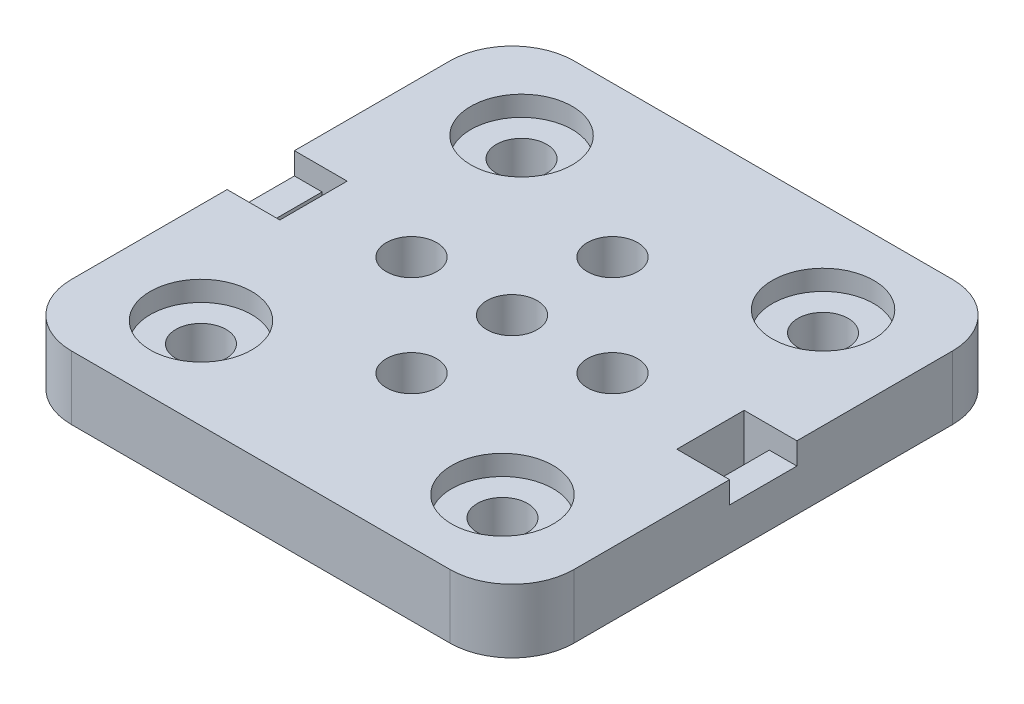
ISO-10303-21;
HEADER;
FILE_DESCRIPTION(('STEP AP214'),'2;1');
FILE_NAME('part.step','',(''),(''),'','','');
FILE_SCHEMA(('AUTOMOTIVE_DESIGN { 1 0 10303 214 1 1 1 1 }'));
ENDSEC;
DATA;
#1=APPLICATION_CONTEXT('core data for automotive mechanical design processes');
#2=APPLICATION_PROTOCOL_DEFINITION('international standard','automotive_design',2000,#1);
#3=PRODUCT_CONTEXT('',#1,'mechanical');
#4=PRODUCT('Part','Part','',(#3));
#5=PRODUCT_RELATED_PRODUCT_CATEGORY('part','',(#4));
#6=PRODUCT_DEFINITION_FORMATION('','',#4);
#7=PRODUCT_DEFINITION_CONTEXT('part definition',#1,'design');
#8=PRODUCT_DEFINITION('design','',#6,#7);
#9=PRODUCT_DEFINITION_SHAPE('','',#8);
#10=(LENGTH_UNIT() NAMED_UNIT(*) SI_UNIT(.MILLI.,.METRE.));
#11=(NAMED_UNIT(*) PLANE_ANGLE_UNIT() SI_UNIT($,.RADIAN.));
#12=(NAMED_UNIT(*) SI_UNIT($,.STERADIAN.) SOLID_ANGLE_UNIT());
#13=UNCERTAINTY_MEASURE_WITH_UNIT(LENGTH_MEASURE(1.E-05),#10,'distance_accuracy_value','');
#14=(GEOMETRIC_REPRESENTATION_CONTEXT(3) GLOBAL_UNCERTAINTY_ASSIGNED_CONTEXT((#13)) GLOBAL_UNIT_ASSIGNED_CONTEXT((#10,
#11,#12)) REPRESENTATION_CONTEXT('',''));
#15=CARTESIAN_POINT('',(0.,0.,0.));
#16=DIRECTION('',(0.,0.,1.));
#17=DIRECTION('',(1.,0.,0.));
#18=AXIS2_PLACEMENT_3D('',#15,#16,#17);
#19=CARTESIAN_POINT('',(0.,0.,0.));
#20=DIRECTION('',(0.,1.,0.));
#21=DIRECTION('',(0.,0.,1.));
#22=AXIS2_PLACEMENT_3D('',#19,#20,#21);
#23=PLANE('',#22);
#24=CARTESIAN_POINT('',(10.,0.,-40.95));
#25=DIRECTION('',(0.,1.,0.));
#26=DIRECTION('',(0.,0.,1.));
#27=AXIS2_PLACEMENT_3D('',#24,#25,#26);
#28=CIRCLE('',#27,5.05);
#29=CARTESIAN_POINT('',(10.,0.,-35.9));
#30=VERTEX_POINT('',#29);
#31=EDGE_CURVE('E589',#30,#30,#28,.F.);
#32=ORIENTED_EDGE('',*,*,#31,.T.);
#33=EDGE_LOOP('',(#32));
#34=FACE_BOUND('',#33,.T.);
#35=CARTESIAN_POINT('',(25.,0.,-15.));
#36=DIRECTION('',(0.,1.,0.));
#37=DIRECTION('',(0.,0.,1.));
#38=AXIS2_PLACEMENT_3D('',#35,#36,#37);
#39=CIRCLE('',#38,2.51);
#40=CARTESIAN_POINT('',(25.,0.,-12.49));
#41=VERTEX_POINT('',#40);
#42=EDGE_CURVE('E227',#41,#41,#39,.T.);
#43=ORIENTED_EDGE('',*,*,#42,.F.);
#44=EDGE_LOOP('',(#43));
#45=FACE_BOUND('',#44,.T.);
#46=CARTESIAN_POINT('',(25.,0.,-35.));
#47=DIRECTION('',(0.,1.,0.));
#48=DIRECTION('',(0.,0.,1.));
#49=AXIS2_PLACEMENT_3D('',#46,#47,#48);
#50=CIRCLE('',#49,2.51);
#51=CARTESIAN_POINT('',(25.,0.,-32.49));
#52=VERTEX_POINT('',#51);
#53=EDGE_CURVE('E230',#52,#52,#50,.T.);
#54=ORIENTED_EDGE('',*,*,#53,.F.);
#55=EDGE_LOOP('',(#54));
#56=FACE_BOUND('',#55,.T.);
#57=CARTESIAN_POINT('',(15.,0.,-25.));
#58=DIRECTION('',(0.,1.,0.));
#59=DIRECTION('',(0.,0.,1.));
#60=AXIS2_PLACEMENT_3D('',#57,#58,#59);
#61=CIRCLE('',#60,2.51);
#62=CARTESIAN_POINT('',(15.,0.,-22.49));
#63=VERTEX_POINT('',#62);
#64=EDGE_CURVE('E233',#63,#63,#61,.T.);
#65=ORIENTED_EDGE('',*,*,#64,.F.);
#66=EDGE_LOOP('',(#65));
#67=FACE_BOUND('',#66,.T.);
#68=CARTESIAN_POINT('',(35.,0.,-25.));
#69=DIRECTION('',(0.,1.,0.));
#70=DIRECTION('',(0.,0.,1.));
#71=AXIS2_PLACEMENT_3D('',#68,#69,#70);
#72=CIRCLE('',#71,2.51);
#73=CARTESIAN_POINT('',(35.,0.,-22.49));
#74=VERTEX_POINT('',#73);
#75=EDGE_CURVE('E236',#74,#74,#72,.T.);
#76=ORIENTED_EDGE('',*,*,#75,.F.);
#77=EDGE_LOOP('',(#76));
#78=FACE_BOUND('',#77,.T.);
#79=CARTESIAN_POINT('',(25.,0.,-25.));
#80=DIRECTION('',(0.,1.,0.));
#81=DIRECTION('',(0.,0.,1.));
#82=AXIS2_PLACEMENT_3D('',#79,#80,#81);
#83=CIRCLE('',#82,2.51);
#84=CARTESIAN_POINT('',(25.,0.,-22.49));
#85=VERTEX_POINT('',#84);
#86=EDGE_CURVE('E239',#85,#85,#83,.T.);
#87=ORIENTED_EDGE('',*,*,#86,.F.);
#88=EDGE_LOOP('',(#87));
#89=FACE_BOUND('',#88,.T.);
#90=DIRECTION('',(1.,0.,0.));
#91=VECTOR('',#90,1.);
#92=CARTESIAN_POINT('',(0.,0.,-28.35));
#93=LINE('',#92,#91);
#94=CARTESIAN_POINT('',(44.75,0.,-28.35));
#95=VERTEX_POINT('',#94);
#96=CARTESIAN_POINT('',(50.,0.,-28.35));
#97=VERTEX_POINT('',#96);
#98=EDGE_CURVE('E224',#95,#97,#93,.T.);
#99=ORIENTED_EDGE('',*,*,#98,.T.);
#100=DIRECTION('',(0.,0.,-1.));
#101=VECTOR('',#100,1.);
#102=CARTESIAN_POINT('',(50.,0.,0.));
#103=LINE('',#102,#101);
#104=CARTESIAN_POINT('',(50.,0.,-43.83));
#105=VERTEX_POINT('',#104);
#106=EDGE_CURVE('E196',#97,#105,#103,.T.);
#107=ORIENTED_EDGE('',*,*,#106,.T.);
#108=CARTESIAN_POINT('',(43.83,0.,-43.83));
#109=DIRECTION('',(0.,1.,0.));
#110=DIRECTION('',(0.,0.,1.));
#111=AXIS2_PLACEMENT_3D('',#108,#109,#110);
#112=CIRCLE('',#111,6.17);
#113=CARTESIAN_POINT('',(43.83,0.,-50.));
#114=VERTEX_POINT('',#113);
#115=EDGE_CURVE('E195',#105,#114,#112,.T.);
#116=ORIENTED_EDGE('',*,*,#115,.T.);
#117=DIRECTION('',(1.,0.,0.));
#118=VECTOR('',#117,1.);
#119=CARTESIAN_POINT('',(0.,0.,-50.));
#120=LINE('',#119,#118);
#121=CARTESIAN_POINT('',(6.17000000000004,0.,-50.));
#122=VERTEX_POINT('',#121);
#123=EDGE_CURVE('E199',#122,#114,#120,.T.);
#124=ORIENTED_EDGE('',*,*,#123,.F.);
#125=CARTESIAN_POINT('',(6.17,0.,-43.83));
#126=DIRECTION('',(0.,1.,0.));
#127=DIRECTION('',(0.,0.,1.));
#128=AXIS2_PLACEMENT_3D('',#125,#126,#127);
#129=CIRCLE('',#128,6.17);
#130=CARTESIAN_POINT('',(0.,0.,-43.83));
#131=VERTEX_POINT('',#130);
#132=EDGE_CURVE('E202',#122,#131,#129,.T.);
#133=ORIENTED_EDGE('',*,*,#132,.T.);
#134=DIRECTION('',(0.,0.,-1.));
#135=VECTOR('',#134,1.);
#136=CARTESIAN_POINT('',(0.,0.,0.));
#137=LINE('',#136,#135);
#138=CARTESIAN_POINT('',(0.,0.,-28.35));
#139=VERTEX_POINT('',#138);
#140=EDGE_CURVE('E205',#139,#131,#137,.T.);
#141=ORIENTED_EDGE('',*,*,#140,.F.);
#142=DIRECTION('',(-1.,0.,0.));
#143=VECTOR('',#142,1.);
#144=CARTESIAN_POINT('',(0.,0.,-28.35));
#145=LINE('',#144,#143);
#146=CARTESIAN_POINT('',(5.25,0.,-28.35));
#147=VERTEX_POINT('',#146);
#148=EDGE_CURVE('E242',#147,#139,#145,.T.);
#149=ORIENTED_EDGE('',*,*,#148,.F.);
#150=DIRECTION('',(0.,0.,-1.));
#151=VECTOR('',#150,1.);
#152=CARTESIAN_POINT('',(5.25,0.,0.));
#153=LINE('',#152,#151);
#154=CARTESIAN_POINT('',(5.25,0.,-21.65));
#155=VERTEX_POINT('',#154);
#156=EDGE_CURVE('E165',#155,#147,#153,.T.);
#157=ORIENTED_EDGE('',*,*,#156,.F.);
#158=DIRECTION('',(-1.,0.,0.));
#159=VECTOR('',#158,1.);
#160=CARTESIAN_POINT('',(0.,0.,-21.65));
#161=LINE('',#160,#159);
#162=CARTESIAN_POINT('',(0.,0.,-21.65));
#163=VERTEX_POINT('',#162);
#164=EDGE_CURVE('E245',#155,#163,#161,.T.);
#165=ORIENTED_EDGE('',*,*,#164,.T.);
#166=CARTESIAN_POINT('',(0.,0.,-6.17000000000004));
#167=VERTEX_POINT('',#166);
#168=EDGE_CURVE('E206',#167,#163,#137,.T.);
#169=ORIENTED_EDGE('',*,*,#168,.F.);
#170=CARTESIAN_POINT('',(6.17,0.,-6.17));
#171=DIRECTION('',(0.,1.,0.));
#172=DIRECTION('',(0.,0.,1.));
#173=AXIS2_PLACEMENT_3D('',#170,#171,#172);
#174=CIRCLE('',#173,6.17);
#175=CARTESIAN_POINT('',(6.17000000000004,0.,0.));
#176=VERTEX_POINT('',#175);
#177=EDGE_CURVE('E209',#167,#176,#174,.T.);
#178=ORIENTED_EDGE('',*,*,#177,.T.);
#179=DIRECTION('',(1.,0.,0.));
#180=VECTOR('',#179,1.);
#181=CARTESIAN_POINT('',(0.,0.,0.));
#182=LINE('',#181,#180);
#183=CARTESIAN_POINT('',(43.83,0.,0.));
#184=VERTEX_POINT('',#183);
#185=EDGE_CURVE('E212',#176,#184,#182,.T.);
#186=ORIENTED_EDGE('',*,*,#185,.T.);
#187=CARTESIAN_POINT('',(43.83,0.,-6.17));
#188=DIRECTION('',(0.,1.,0.));
#189=DIRECTION('',(0.,0.,1.));
#190=AXIS2_PLACEMENT_3D('',#187,#188,#189);
#191=CIRCLE('',#190,6.17);
#192=CARTESIAN_POINT('',(50.,0.,-6.17000000000004));
#193=VERTEX_POINT('',#192);
#194=EDGE_CURVE('E215',#193,#184,#191,.F.);
#195=ORIENTED_EDGE('',*,*,#194,.F.);
#196=CARTESIAN_POINT('',(50.,0.,-21.65));
#197=VERTEX_POINT('',#196);
#198=EDGE_CURVE('E192',#193,#197,#103,.T.);
#199=ORIENTED_EDGE('',*,*,#198,.T.);
#200=DIRECTION('',(1.,0.,0.));
#201=VECTOR('',#200,1.);
#202=CARTESIAN_POINT('',(0.,0.,-21.65));
#203=LINE('',#202,#201);
#204=CARTESIAN_POINT('',(44.75,0.,-21.65));
#205=VERTEX_POINT('',#204);
#206=EDGE_CURVE('E218',#205,#197,#203,.T.);
#207=ORIENTED_EDGE('',*,*,#206,.F.);
#208=DIRECTION('',(0.,0.,-1.));
#209=VECTOR('',#208,1.);
#210=CARTESIAN_POINT('',(44.75,0.,0.));
#211=LINE('',#210,#209);
#212=EDGE_CURVE('E221',#205,#95,#211,.T.);
#213=ORIENTED_EDGE('',*,*,#212,.T.);
#214=EDGE_LOOP('',(#99,#107,#116,#124,#133,#141,#149,#157,#165,#169,#178,#186,#195,#199,#207,#213));
#215=FACE_BOUND('',#214,.T.);
#216=CARTESIAN_POINT('',(10.,0.,-9.05));
#217=DIRECTION('',(0.,1.,0.));
#218=DIRECTION('',(0.,0.,1.));
#219=AXIS2_PLACEMENT_3D('',#216,#217,#218);
#220=CIRCLE('',#219,5.05);
#221=CARTESIAN_POINT('',(10.,0.,-4.));
#222=VERTEX_POINT('',#221);
#223=EDGE_CURVE('E610',#222,#222,#220,.T.);
#224=ORIENTED_EDGE('',*,*,#223,.F.);
#225=EDGE_LOOP('',(#224));
#226=FACE_BOUND('',#225,.T.);
#227=CARTESIAN_POINT('',(40.,0.,-9.05));
#228=DIRECTION('',(0.,1.,0.));
#229=DIRECTION('',(0.,0.,1.));
#230=AXIS2_PLACEMENT_3D('',#227,#228,#229);
#231=CIRCLE('',#230,5.05);
#232=CARTESIAN_POINT('',(40.,0.,-4.));
#233=VERTEX_POINT('',#232);
#234=EDGE_CURVE('E601',#233,#233,#231,.T.);
#235=ORIENTED_EDGE('',*,*,#234,.F.);
#236=EDGE_LOOP('',(#235));
#237=FACE_BOUND('',#236,.T.);
#238=CARTESIAN_POINT('',(40.,0.,-40.95));
#239=DIRECTION('',(0.,1.,0.));
#240=DIRECTION('',(0.,0.,1.));
#241=AXIS2_PLACEMENT_3D('',#238,#239,#240);
#242=CIRCLE('',#241,5.05);
#243=CARTESIAN_POINT('',(40.,0.,-35.9));
#244=VERTEX_POINT('',#243);
#245=EDGE_CURVE('E592',#244,#244,#242,.F.);
#246=ORIENTED_EDGE('',*,*,#245,.T.);
#247=EDGE_LOOP('',(#246));
#248=FACE_BOUND('',#247,.T.);
#249=ADVANCED_FACE('F34',(#34,#45,#56,#67,#78,#89,#215,#226,#237,#248),#23,.T.);
#250=CARTESIAN_POINT('',(40.,-6.35,-40.95));
#251=DIRECTION('',(0.,1.,0.));
#252=DIRECTION('',(0.,0.,1.));
#253=AXIS2_PLACEMENT_3D('',#250,#251,#252);
#254=CYLINDRICAL_SURFACE('',#253,2.5);
#255=CARTESIAN_POINT('',(40.,-6.35,-40.95));
#256=DIRECTION('',(0.,1.,0.));
#257=DIRECTION('',(0.,0.,1.));
#258=AXIS2_PLACEMENT_3D('',#255,#256,#257);
#259=CIRCLE('',#258,2.5);
#260=CARTESIAN_POINT('',(40.,-6.35,-38.45));
#261=VERTEX_POINT('',#260);
#262=EDGE_CURVE('E186',#261,#261,#259,.F.);
#263=ORIENTED_EDGE('',*,*,#262,.T.);
#264=EDGE_LOOP('',(#263));
#265=FACE_BOUND('',#264,.T.);
#266=CARTESIAN_POINT('',(40.,-2.,-40.95));
#267=DIRECTION('',(0.,1.,0.));
#268=DIRECTION('',(0.,0.,1.));
#269=AXIS2_PLACEMENT_3D('',#266,#267,#268);
#270=CIRCLE('',#269,2.5);
#271=CARTESIAN_POINT('',(40.,-2.,-38.45));
#272=VERTEX_POINT('',#271);
#273=EDGE_CURVE('E587',#272,#272,#270,.F.);
#274=ORIENTED_EDGE('',*,*,#273,.F.);
#275=EDGE_LOOP('',(#274));
#276=FACE_BOUND('',#275,.T.);
#277=ADVANCED_FACE('F354',(#265,#276),#254,.F.);
#278=CARTESIAN_POINT('',(40.,-6.35,-9.05));
#279=DIRECTION('',(0.,1.,0.));
#280=DIRECTION('',(0.,0.,1.));
#281=AXIS2_PLACEMENT_3D('',#278,#279,#280);
#282=CYLINDRICAL_SURFACE('',#281,2.5);
#283=CARTESIAN_POINT('',(40.,-6.35,-9.05));
#284=DIRECTION('',(0.,1.,0.));
#285=DIRECTION('',(0.,0.,1.));
#286=AXIS2_PLACEMENT_3D('',#283,#284,#285);
#287=CIRCLE('',#286,2.5);
#288=CARTESIAN_POINT('',(40.,-6.35,-6.55));
#289=VERTEX_POINT('',#288);
#290=EDGE_CURVE('E183',#289,#289,#287,.T.);
#291=ORIENTED_EDGE('',*,*,#290,.F.);
#292=EDGE_LOOP('',(#291));
#293=FACE_BOUND('',#292,.T.);
#294=CARTESIAN_POINT('',(40.,-2.,-9.05));
#295=DIRECTION('',(0.,1.,0.));
#296=DIRECTION('',(0.,0.,1.));
#297=AXIS2_PLACEMENT_3D('',#294,#295,#296);
#298=CIRCLE('',#297,2.5);
#299=CARTESIAN_POINT('',(40.,-2.,-6.55));
#300=VERTEX_POINT('',#299);
#301=EDGE_CURVE('E598',#300,#300,#298,.T.);
#302=ORIENTED_EDGE('',*,*,#301,.T.);
#303=EDGE_LOOP('',(#302));
#304=FACE_BOUND('',#303,.T.);
#305=ADVANCED_FACE('F360',(#293,#304),#282,.F.);
#306=CARTESIAN_POINT('',(10.,-6.35,-9.05));
#307=DIRECTION('',(0.,1.,0.));
#308=DIRECTION('',(0.,0.,1.));
#309=AXIS2_PLACEMENT_3D('',#306,#307,#308);
#310=CYLINDRICAL_SURFACE('',#309,2.5);
#311=CARTESIAN_POINT('',(10.,-6.35,-9.05));
#312=DIRECTION('',(0.,1.,0.));
#313=DIRECTION('',(0.,0.,1.));
#314=AXIS2_PLACEMENT_3D('',#311,#312,#313);
#315=CIRCLE('',#314,2.5);
#316=CARTESIAN_POINT('',(10.,-6.35,-6.55));
#317=VERTEX_POINT('',#316);
#318=EDGE_CURVE('E180',#317,#317,#315,.T.);
#319=ORIENTED_EDGE('',*,*,#318,.F.);
#320=EDGE_LOOP('',(#319));
#321=FACE_BOUND('',#320,.T.);
#322=CARTESIAN_POINT('',(10.,-2.,-9.05));
#323=DIRECTION('',(0.,1.,0.));
#324=DIRECTION('',(0.,0.,1.));
#325=AXIS2_PLACEMENT_3D('',#322,#323,#324);
#326=CIRCLE('',#325,2.5);
#327=CARTESIAN_POINT('',(10.,-2.,-6.55));
#328=VERTEX_POINT('',#327);
#329=EDGE_CURVE('E607',#328,#328,#326,.T.);
#330=ORIENTED_EDGE('',*,*,#329,.T.);
#331=EDGE_LOOP('',(#330));
#332=FACE_BOUND('',#331,.T.);
#333=ADVANCED_FACE('F371',(#321,#332),#310,.F.);
#334=CARTESIAN_POINT('',(10.,-6.35,-40.95));
#335=DIRECTION('',(0.,1.,0.));
#336=DIRECTION('',(0.,0.,1.));
#337=AXIS2_PLACEMENT_3D('',#334,#335,#336);
#338=CYLINDRICAL_SURFACE('',#337,2.5);
#339=CARTESIAN_POINT('',(10.,-6.35,-40.95));
#340=DIRECTION('',(0.,1.,0.));
#341=DIRECTION('',(0.,0.,1.));
#342=AXIS2_PLACEMENT_3D('',#339,#340,#341);
#343=CIRCLE('',#342,2.5);
#344=CARTESIAN_POINT('',(10.,-6.35,-38.45));
#345=VERTEX_POINT('',#344);
#346=EDGE_CURVE('E189',#345,#345,#343,.F.);
#347=ORIENTED_EDGE('',*,*,#346,.T.);
#348=EDGE_LOOP('',(#347));
#349=FACE_BOUND('',#348,.T.);
#350=CARTESIAN_POINT('',(10.,-2.,-40.95));
#351=DIRECTION('',(0.,1.,0.));
#352=DIRECTION('',(0.,0.,1.));
#353=AXIS2_PLACEMENT_3D('',#350,#351,#352);
#354=CIRCLE('',#353,2.5);
#355=CARTESIAN_POINT('',(10.,-2.,-38.45));
#356=VERTEX_POINT('',#355);
#357=EDGE_CURVE('E492',#356,#356,#354,.F.);
#358=ORIENTED_EDGE('',*,*,#357,.F.);
#359=EDGE_LOOP('',(#358));
#360=FACE_BOUND('',#359,.T.);
#361=ADVANCED_FACE('F368',(#349,#360),#338,.F.);
#362=CARTESIAN_POINT('',(47.25,-6.35,0.));
#363=DIRECTION('',(-1.,0.,0.));
#364=DIRECTION('',(0.,0.,1.));
#365=AXIS2_PLACEMENT_3D('',#362,#363,#364);
#366=PLANE('',#365);
#367=DIRECTION('',(0.,1.,0.));
#368=VECTOR('',#367,1.);
#369=CARTESIAN_POINT('',(47.25,-6.35,-21.65));
#370=LINE('',#369,#368);
#371=CARTESIAN_POINT('',(47.25,-6.35,-21.65));
#372=VERTEX_POINT('',#371);
#373=CARTESIAN_POINT('',(47.25,-2.18,-21.65));
#374=VERTEX_POINT('',#373);
#375=EDGE_CURVE('E258',#372,#374,#370,.T.);
#376=ORIENTED_EDGE('',*,*,#375,.T.);
#377=DIRECTION('',(0.,0.,1.));
#378=VECTOR('',#377,1.);
#379=CARTESIAN_POINT('',(47.25,-2.18,0.));
#380=LINE('',#379,#378);
#381=CARTESIAN_POINT('',(47.25,-2.18,-28.35));
#382=VERTEX_POINT('',#381);
#383=EDGE_CURVE('E51',#382,#374,#380,.T.);
#384=ORIENTED_EDGE('',*,*,#383,.F.);
#385=DIRECTION('',(0.,1.,0.));
#386=VECTOR('',#385,1.);
#387=CARTESIAN_POINT('',(47.25,-6.35,-28.35));
#388=LINE('',#387,#386);
#389=CARTESIAN_POINT('',(47.25,-6.35,-28.35));
#390=VERTEX_POINT('',#389);
#391=EDGE_CURVE('E251',#390,#382,#388,.T.);
#392=ORIENTED_EDGE('',*,*,#391,.F.);
#393=DIRECTION('',(0.,0.,1.));
#394=VECTOR('',#393,1.);
#395=CARTESIAN_POINT('',(47.25,-6.35,0.));
#396=LINE('',#395,#394);
#397=EDGE_CURVE('E320',#390,#372,#396,.T.);
#398=ORIENTED_EDGE('',*,*,#397,.T.);
#399=EDGE_LOOP('',(#376,#384,#392,#398));
#400=FACE_BOUND('',#399,.T.);
#401=ADVANCED_FACE('F370',(#400),#366,.T.);
#402=CARTESIAN_POINT('',(50.,-6.35,0.));
#403=DIRECTION('',(1.,0.,0.));
#404=DIRECTION('',(0.,0.,-1.));
#405=AXIS2_PLACEMENT_3D('',#402,#403,#404);
#406=PLANE('',#405);
#407=ORIENTED_EDGE('',*,*,#106,.F.);
#408=DIRECTION('',(0.,1.,0.));
#409=VECTOR('',#408,1.);
#410=CARTESIAN_POINT('',(50.,-2.18,-28.35));
#411=LINE('',#410,#409);
#412=CARTESIAN_POINT('',(50.,-2.18,-28.35));
#413=VERTEX_POINT('',#412);
#414=EDGE_CURVE('E499',#413,#97,#411,.T.);
#415=ORIENTED_EDGE('',*,*,#414,.F.);
#416=DIRECTION('',(0.,0.,-1.));
#417=VECTOR('',#416,1.);
#418=CARTESIAN_POINT('',(50.,-2.18,0.));
#419=LINE('',#418,#417);
#420=CARTESIAN_POINT('',(50.,-2.18,-21.65));
#421=VERTEX_POINT('',#420);
#422=EDGE_CURVE('E490',#421,#413,#419,.T.);
#423=ORIENTED_EDGE('',*,*,#422,.F.);
#424=DIRECTION('',(0.,1.,0.));
#425=VECTOR('',#424,1.);
#426=CARTESIAN_POINT('',(50.,-2.18,-21.65));
#427=LINE('',#426,#425);
#428=EDGE_CURVE('E498',#421,#197,#427,.T.);
#429=ORIENTED_EDGE('',*,*,#428,.T.);
#430=ORIENTED_EDGE('',*,*,#198,.F.);
#431=DIRECTION('',(0.,1.,0.));
#432=VECTOR('',#431,1.);
#433=CARTESIAN_POINT('',(50.,-6.35,-6.17000000000004));
#434=LINE('',#433,#432);
#435=CARTESIAN_POINT('',(50.,-6.35,-6.17000000000004));
#436=VERTEX_POINT('',#435);
#437=EDGE_CURVE('E261',#436,#193,#434,.T.);
#438=ORIENTED_EDGE('',*,*,#437,.F.);
#439=DIRECTION('',(0.,0.,-1.));
#440=VECTOR('',#439,1.);
#441=CARTESIAN_POINT('',(50.,-6.35,0.));
#442=LINE('',#441,#440);
#443=CARTESIAN_POINT('',(50.,-6.35,-43.83));
#444=VERTEX_POINT('',#443);
#445=EDGE_CURVE('E247',#436,#444,#442,.T.);
#446=ORIENTED_EDGE('',*,*,#445,.T.);
#447=DIRECTION('',(0.,1.,0.));
#448=VECTOR('',#447,1.);
#449=CARTESIAN_POINT('',(50.,-6.35,-43.83));
#450=LINE('',#449,#448);
#451=EDGE_CURVE('E38',#444,#105,#450,.T.);
#452=ORIENTED_EDGE('',*,*,#451,.T.);
#453=EDGE_LOOP('',(#407,#415,#423,#429,#430,#438,#446,#452));
#454=FACE_BOUND('',#453,.T.);
#455=ADVANCED_FACE('F36',(#454),#406,.T.);
#456=CARTESIAN_POINT('',(2.75,-6.35,0.));
#457=DIRECTION('',(-1.,0.,0.));
#458=DIRECTION('',(0.,0.,1.));
#459=AXIS2_PLACEMENT_3D('',#456,#457,#458);
#460=PLANE('',#459);
#461=DIRECTION('',(0.,0.,1.));
#462=VECTOR('',#461,1.);
#463=CARTESIAN_POINT('',(2.75,-2.18,0.));
#464=LINE('',#463,#462);
#465=CARTESIAN_POINT('',(2.75,-2.18,-28.35));
#466=VERTEX_POINT('',#465);
#467=CARTESIAN_POINT('',(2.75,-2.18,-21.65));
#468=VERTEX_POINT('',#467);
#469=EDGE_CURVE('E501',#466,#468,#464,.T.);
#470=ORIENTED_EDGE('',*,*,#469,.T.);
#471=DIRECTION('',(0.,1.,0.));
#472=VECTOR('',#471,1.);
#473=CARTESIAN_POINT('',(2.75,-6.35,-21.65));
#474=LINE('',#473,#472);
#475=CARTESIAN_POINT('',(2.75,-6.35,-21.65));
#476=VERTEX_POINT('',#475);
#477=EDGE_CURVE('E11',#476,#468,#474,.T.);
#478=ORIENTED_EDGE('',*,*,#477,.F.);
#479=DIRECTION('',(0.,0.,1.));
#480=VECTOR('',#479,1.);
#481=CARTESIAN_POINT('',(2.75,-6.35,0.));
#482=LINE('',#481,#480);
#483=CARTESIAN_POINT('',(2.75,-6.35,-28.35));
#484=VERTEX_POINT('',#483);
#485=EDGE_CURVE('E60',#484,#476,#482,.T.);
#486=ORIENTED_EDGE('',*,*,#485,.F.);
#487=DIRECTION('',(0.,1.,0.));
#488=VECTOR('',#487,1.);
#489=CARTESIAN_POINT('',(2.75,-6.35,-28.35));
#490=LINE('',#489,#488);
#491=EDGE_CURVE('E169',#484,#466,#490,.T.);
#492=ORIENTED_EDGE('',*,*,#491,.T.);
#493=EDGE_LOOP('',(#470,#478,#486,#492));
#494=FACE_BOUND('',#493,.T.);
#495=ADVANCED_FACE('F390',(#494),#460,.F.);
#496=CARTESIAN_POINT('',(0.,-6.35,0.));
#497=DIRECTION('',(1.,0.,0.));
#498=DIRECTION('',(0.,0.,-1.));
#499=AXIS2_PLACEMENT_3D('',#496,#497,#498);
#500=PLANE('',#499);
#501=DIRECTION('',(0.,1.,0.));
#502=VECTOR('',#501,1.);
#503=CARTESIAN_POINT('',(0.,-2.18,-21.65));
#504=LINE('',#503,#502);
#505=CARTESIAN_POINT('',(0.,-2.18,-21.65));
#506=VERTEX_POINT('',#505);
#507=EDGE_CURVE('E288',#506,#163,#504,.T.);
#508=ORIENTED_EDGE('',*,*,#507,.F.);
#509=DIRECTION('',(0.,0.,-1.));
#510=VECTOR('',#509,1.);
#511=CARTESIAN_POINT('',(0.,-2.18,0.));
#512=LINE('',#511,#510);
#513=CARTESIAN_POINT('',(0.,-2.18,-28.35));
#514=VERTEX_POINT('',#513);
#515=EDGE_CURVE('E508',#506,#514,#512,.T.);
#516=ORIENTED_EDGE('',*,*,#515,.T.);
#517=DIRECTION('',(0.,1.,0.));
#518=VECTOR('',#517,1.);
#519=CARTESIAN_POINT('',(0.,-2.18,-28.35));
#520=LINE('',#519,#518);
#521=EDGE_CURVE('E290',#514,#139,#520,.T.);
#522=ORIENTED_EDGE('',*,*,#521,.T.);
#523=ORIENTED_EDGE('',*,*,#140,.T.);
#524=DIRECTION('',(0.,1.,0.));
#525=VECTOR('',#524,1.);
#526=CARTESIAN_POINT('',(0.,-6.35,-43.83));
#527=LINE('',#526,#525);
#528=CARTESIAN_POINT('',(0.,-6.35,-43.83));
#529=VERTEX_POINT('',#528);
#530=EDGE_CURVE('E269',#529,#131,#527,.T.);
#531=ORIENTED_EDGE('',*,*,#530,.F.);
#532=DIRECTION('',(0.,0.,-1.));
#533=VECTOR('',#532,1.);
#534=CARTESIAN_POINT('',(0.,-6.35,0.));
#535=LINE('',#534,#533);
#536=CARTESIAN_POINT('',(0.,-6.35,-6.17000000000004));
#537=VERTEX_POINT('',#536);
#538=EDGE_CURVE('E310',#537,#529,#535,.T.);
#539=ORIENTED_EDGE('',*,*,#538,.F.);
#540=DIRECTION('',(0.,1.,0.));
#541=VECTOR('',#540,1.);
#542=CARTESIAN_POINT('',(0.,-6.35,-6.17000000000004));
#543=LINE('',#542,#541);
#544=EDGE_CURVE('E267',#537,#167,#543,.T.);
#545=ORIENTED_EDGE('',*,*,#544,.T.);
#546=ORIENTED_EDGE('',*,*,#168,.T.);
#547=EDGE_LOOP('',(#508,#516,#522,#523,#531,#539,#545,#546));
#548=FACE_BOUND('',#547,.T.);
#549=ADVANCED_FACE('F383',(#548),#500,.F.);
#550=CARTESIAN_POINT('',(0.,-6.35,-21.65));
#551=DIRECTION('',(0.,0.,-1.));
#552=DIRECTION('',(-1.,0.,0.));
#553=AXIS2_PLACEMENT_3D('',#550,#551,#552);
#554=PLANE('',#553);
#555=ORIENTED_EDGE('',*,*,#164,.F.);
#556=DIRECTION('',(0.,1.,0.));
#557=VECTOR('',#556,1.);
#558=CARTESIAN_POINT('',(5.25,-6.35,-21.65));
#559=LINE('',#558,#557);
#560=CARTESIAN_POINT('',(5.25,-6.35,-21.65));
#561=VERTEX_POINT('',#560);
#562=EDGE_CURVE('E43',#561,#155,#559,.T.);
#563=ORIENTED_EDGE('',*,*,#562,.F.);
#564=DIRECTION('',(-1.,0.,0.));
#565=VECTOR('',#564,1.);
#566=CARTESIAN_POINT('',(0.,-6.35,-21.65));
#567=LINE('',#566,#565);
#568=EDGE_CURVE('E160',#561,#476,#567,.T.);
#569=ORIENTED_EDGE('',*,*,#568,.T.);
#570=ORIENTED_EDGE('',*,*,#477,.T.);
#571=DIRECTION('',(-1.,0.,0.));
#572=VECTOR('',#571,1.);
#573=CARTESIAN_POINT('',(0.,-2.18,-21.65));
#574=LINE('',#573,#572);
#575=EDGE_CURVE('E297',#468,#506,#574,.T.);
#576=ORIENTED_EDGE('',*,*,#575,.T.);
#577=ORIENTED_EDGE('',*,*,#507,.T.);
#578=EDGE_LOOP('',(#555,#563,#569,#570,#576,#577));
#579=FACE_BOUND('',#578,.T.);
#580=ADVANCED_FACE('F380',(#579),#554,.T.);
#581=CARTESIAN_POINT('',(5.25,-6.35,0.));
#582=DIRECTION('',(1.,0.,0.));
#583=DIRECTION('',(0.,0.,-1.));
#584=AXIS2_PLACEMENT_3D('',#581,#582,#583);
#585=PLANE('',#584);
#586=ORIENTED_EDGE('',*,*,#156,.T.);
#587=DIRECTION('',(0.,1.,0.));
#588=VECTOR('',#587,1.);
#589=CARTESIAN_POINT('',(5.25,-6.35,-28.35));
#590=LINE('',#589,#588);
#591=CARTESIAN_POINT('',(5.25,-6.35,-28.35));
#592=VERTEX_POINT('',#591);
#593=EDGE_CURVE('E163',#592,#147,#590,.T.);
#594=ORIENTED_EDGE('',*,*,#593,.F.);
#595=DIRECTION('',(0.,0.,-1.));
#596=VECTOR('',#595,1.);
#597=CARTESIAN_POINT('',(5.25,-6.35,0.));
#598=LINE('',#597,#596);
#599=EDGE_CURVE('E152',#561,#592,#598,.T.);
#600=ORIENTED_EDGE('',*,*,#599,.F.);
#601=ORIENTED_EDGE('',*,*,#562,.T.);
#602=EDGE_LOOP('',(#586,#594,#600,#601));
#603=FACE_BOUND('',#602,.T.);
#604=ADVANCED_FACE('F164',(#603),#585,.F.);
#605=CARTESIAN_POINT('',(0.,-6.35,-28.35));
#606=DIRECTION('',(0.,0.,1.));
#607=DIRECTION('',(1.,0.,0.));
#608=AXIS2_PLACEMENT_3D('',#605,#606,#607);
#609=PLANE('',#608);
#610=ORIENTED_EDGE('',*,*,#98,.F.);
#611=DIRECTION('',(0.,1.,0.));
#612=VECTOR('',#611,1.);
#613=CARTESIAN_POINT('',(44.75,-6.35,-28.35));
#614=LINE('',#613,#612);
#615=CARTESIAN_POINT('',(44.75,-6.35,-28.35));
#616=VERTEX_POINT('',#615);
#617=EDGE_CURVE('E254',#616,#95,#614,.T.);
#618=ORIENTED_EDGE('',*,*,#617,.F.);
#619=DIRECTION('',(1.,0.,0.));
#620=VECTOR('',#619,1.);
#621=CARTESIAN_POINT('',(0.,-6.35,-28.35));
#622=LINE('',#621,#620);
#623=EDGE_CURVE('E328',#616,#390,#622,.T.);
#624=ORIENTED_EDGE('',*,*,#623,.T.);
#625=ORIENTED_EDGE('',*,*,#391,.T.);
#626=DIRECTION('',(1.,0.,0.));
#627=VECTOR('',#626,1.);
#628=CARTESIAN_POINT('',(0.,-2.18,-28.35));
#629=LINE('',#628,#627);
#630=EDGE_CURVE('E488',#382,#413,#629,.T.);
#631=ORIENTED_EDGE('',*,*,#630,.T.);
#632=ORIENTED_EDGE('',*,*,#414,.T.);
#633=EDGE_LOOP('',(#610,#618,#624,#625,#631,#632));
#634=FACE_BOUND('',#633,.T.);
#635=ADVANCED_FACE('F386',(#634),#609,.T.);
#636=CARTESIAN_POINT('',(44.75,-6.35,0.));
#637=DIRECTION('',(1.,0.,0.));
#638=DIRECTION('',(0.,0.,-1.));
#639=AXIS2_PLACEMENT_3D('',#636,#637,#638);
#640=PLANE('',#639);
#641=ORIENTED_EDGE('',*,*,#212,.F.);
#642=DIRECTION('',(0.,1.,0.));
#643=VECTOR('',#642,1.);
#644=CARTESIAN_POINT('',(44.75,-6.35,-21.65));
#645=LINE('',#644,#643);
#646=CARTESIAN_POINT('',(44.75,-6.35,-21.65));
#647=VERTEX_POINT('',#646);
#648=EDGE_CURVE('E256',#647,#205,#645,.T.);
#649=ORIENTED_EDGE('',*,*,#648,.F.);
#650=DIRECTION('',(0.,0.,-1.));
#651=VECTOR('',#650,1.);
#652=CARTESIAN_POINT('',(44.75,-6.35,0.));
#653=LINE('',#652,#651);
#654=EDGE_CURVE('E325',#647,#616,#653,.T.);
#655=ORIENTED_EDGE('',*,*,#654,.T.);
#656=ORIENTED_EDGE('',*,*,#617,.T.);
#657=EDGE_LOOP('',(#641,#649,#655,#656));
#658=FACE_BOUND('',#657,.T.);
#659=ADVANCED_FACE('F412',(#658),#640,.T.);
#660=CARTESIAN_POINT('',(43.83,-6.35,-6.17));
#661=DIRECTION('',(0.,1.,0.));
#662=DIRECTION('',(0.,0.,1.));
#663=AXIS2_PLACEMENT_3D('',#660,#661,#662);
#664=CYLINDRICAL_SURFACE('',#663,6.17);
#665=ORIENTED_EDGE('',*,*,#194,.T.);
#666=DIRECTION('',(0.,1.,0.));
#667=VECTOR('',#666,1.);
#668=CARTESIAN_POINT('',(43.83,-6.35,0.));
#669=LINE('',#668,#667);
#670=CARTESIAN_POINT('',(43.83,-6.35,0.));
#671=VERTEX_POINT('',#670);
#672=EDGE_CURVE('E263',#671,#184,#669,.T.);
#673=ORIENTED_EDGE('',*,*,#672,.F.);
#674=CARTESIAN_POINT('',(43.83,-6.35,-6.17));
#675=DIRECTION('',(0.,1.,0.));
#676=DIRECTION('',(0.,0.,1.));
#677=AXIS2_PLACEMENT_3D('',#674,#675,#676);
#678=CIRCLE('',#677,6.17);
#679=EDGE_CURVE('E318',#436,#671,#678,.F.);
#680=ORIENTED_EDGE('',*,*,#679,.F.);
#681=ORIENTED_EDGE('',*,*,#437,.T.);
#682=EDGE_LOOP('',(#665,#673,#680,#681));
#683=FACE_BOUND('',#682,.T.);
#684=ADVANCED_FACE('F416',(#683),#664,.T.);
#685=CARTESIAN_POINT('',(0.,-6.35,0.));
#686=DIRECTION('',(0.,0.,1.));
#687=DIRECTION('',(1.,0.,0.));
#688=AXIS2_PLACEMENT_3D('',#685,#686,#687);
#689=PLANE('',#688);
#690=ORIENTED_EDGE('',*,*,#185,.F.);
#691=DIRECTION('',(0.,1.,0.));
#692=VECTOR('',#691,1.);
#693=CARTESIAN_POINT('',(6.17000000000004,-6.35,0.));
#694=LINE('',#693,#692);
#695=CARTESIAN_POINT('',(6.17000000000004,-6.35,0.));
#696=VERTEX_POINT('',#695);
#697=EDGE_CURVE('E265',#696,#176,#694,.T.);
#698=ORIENTED_EDGE('',*,*,#697,.F.);
#699=DIRECTION('',(1.,0.,0.));
#700=VECTOR('',#699,1.);
#701=CARTESIAN_POINT('',(0.,-6.35,0.));
#702=LINE('',#701,#700);
#703=EDGE_CURVE('E315',#696,#671,#702,.T.);
#704=ORIENTED_EDGE('',*,*,#703,.T.);
#705=ORIENTED_EDGE('',*,*,#672,.T.);
#706=EDGE_LOOP('',(#690,#698,#704,#705));
#707=FACE_BOUND('',#706,.T.);
#708=ADVANCED_FACE('F426',(#707),#689,.T.);
#709=CARTESIAN_POINT('',(6.17,-6.35,-6.17));
#710=DIRECTION('',(0.,1.,0.));
#711=DIRECTION('',(0.,0.,1.));
#712=AXIS2_PLACEMENT_3D('',#709,#710,#711);
#713=CYLINDRICAL_SURFACE('',#712,6.17);
#714=ORIENTED_EDGE('',*,*,#177,.F.);
#715=ORIENTED_EDGE('',*,*,#544,.F.);
#716=CARTESIAN_POINT('',(6.17,-6.35,-6.17));
#717=DIRECTION('',(0.,1.,0.));
#718=DIRECTION('',(0.,0.,1.));
#719=AXIS2_PLACEMENT_3D('',#716,#717,#718);
#720=CIRCLE('',#719,6.17);
#721=EDGE_CURVE('E312',#537,#696,#720,.T.);
#722=ORIENTED_EDGE('',*,*,#721,.T.);
#723=ORIENTED_EDGE('',*,*,#697,.T.);
#724=EDGE_LOOP('',(#714,#715,#722,#723));
#725=FACE_BOUND('',#724,.T.);
#726=ADVANCED_FACE('F430',(#725),#713,.T.);
#727=CARTESIAN_POINT('',(6.17,-6.35,-43.83));
#728=DIRECTION('',(0.,1.,0.));
#729=DIRECTION('',(0.,0.,1.));
#730=AXIS2_PLACEMENT_3D('',#727,#728,#729);
#731=CYLINDRICAL_SURFACE('',#730,6.17);
#732=ORIENTED_EDGE('',*,*,#132,.F.);
#733=DIRECTION('',(0.,1.,0.));
#734=VECTOR('',#733,1.);
#735=CARTESIAN_POINT('',(6.17000000000004,-6.35,-50.));
#736=LINE('',#735,#734);
#737=CARTESIAN_POINT('',(6.17000000000004,-6.35,-50.));
#738=VERTEX_POINT('',#737);
#739=EDGE_CURVE('E272',#738,#122,#736,.T.);
#740=ORIENTED_EDGE('',*,*,#739,.F.);
#741=CARTESIAN_POINT('',(6.17,-6.35,-43.83));
#742=DIRECTION('',(0.,1.,0.));
#743=DIRECTION('',(0.,0.,1.));
#744=AXIS2_PLACEMENT_3D('',#741,#742,#743);
#745=CIRCLE('',#744,6.17);
#746=EDGE_CURVE('E307',#738,#529,#745,.T.);
#747=ORIENTED_EDGE('',*,*,#746,.T.);
#748=ORIENTED_EDGE('',*,*,#530,.T.);
#749=EDGE_LOOP('',(#732,#740,#747,#748));
#750=FACE_BOUND('',#749,.T.);
#751=ADVANCED_FACE('F434',(#750),#731,.T.);
#752=CARTESIAN_POINT('',(0.,-6.35,-50.));
#753=DIRECTION('',(0.,0.,1.));
#754=DIRECTION('',(1.,0.,0.));
#755=AXIS2_PLACEMENT_3D('',#752,#753,#754);
#756=PLANE('',#755);
#757=ORIENTED_EDGE('',*,*,#123,.T.);
#758=DIRECTION('',(0.,1.,0.));
#759=VECTOR('',#758,1.);
#760=CARTESIAN_POINT('',(43.83,-6.35,-50.));
#761=LINE('',#760,#759);
#762=CARTESIAN_POINT('',(43.83,-6.35,-50.));
#763=VERTEX_POINT('',#762);
#764=EDGE_CURVE('E273',#763,#114,#761,.T.);
#765=ORIENTED_EDGE('',*,*,#764,.F.);
#766=DIRECTION('',(1.,0.,0.));
#767=VECTOR('',#766,1.);
#768=CARTESIAN_POINT('',(0.,-6.35,-50.));
#769=LINE('',#768,#767);
#770=EDGE_CURVE('E305',#738,#763,#769,.T.);
#771=ORIENTED_EDGE('',*,*,#770,.F.);
#772=ORIENTED_EDGE('',*,*,#739,.T.);
#773=EDGE_LOOP('',(#757,#765,#771,#772));
#774=FACE_BOUND('',#773,.T.);
#775=ADVANCED_FACE('F389',(#774),#756,.F.);
#776=CARTESIAN_POINT('',(0.,-6.35,-28.35));
#777=DIRECTION('',(0.,0.,-1.));
#778=DIRECTION('',(-1.,0.,0.));
#779=AXIS2_PLACEMENT_3D('',#776,#777,#778);
#780=PLANE('',#779);
#781=ORIENTED_EDGE('',*,*,#148,.T.);
#782=ORIENTED_EDGE('',*,*,#521,.F.);
#783=DIRECTION('',(-1.,0.,0.));
#784=VECTOR('',#783,1.);
#785=CARTESIAN_POINT('',(0.,-2.18,-28.35));
#786=LINE('',#785,#784);
#787=EDGE_CURVE('E506',#466,#514,#786,.T.);
#788=ORIENTED_EDGE('',*,*,#787,.F.);
#789=ORIENTED_EDGE('',*,*,#491,.F.);
#790=DIRECTION('',(-1.,0.,0.));
#791=VECTOR('',#790,1.);
#792=CARTESIAN_POINT('',(0.,-6.35,-28.35));
#793=LINE('',#792,#791);
#794=EDGE_CURVE('E157',#592,#484,#793,.T.);
#795=ORIENTED_EDGE('',*,*,#794,.F.);
#796=ORIENTED_EDGE('',*,*,#593,.T.);
#797=EDGE_LOOP('',(#781,#782,#788,#789,#795,#796));
#798=FACE_BOUND('',#797,.T.);
#799=ADVANCED_FACE('F171',(#798),#780,.F.);
#800=CARTESIAN_POINT('',(25.,-6.35,-25.));
#801=DIRECTION('',(0.,1.,0.));
#802=DIRECTION('',(0.,0.,1.));
#803=AXIS2_PLACEMENT_3D('',#800,#801,#802);
#804=CYLINDRICAL_SURFACE('',#803,2.51);
#805=CARTESIAN_POINT('',(25.,-6.35,-25.));
#806=DIRECTION('',(0.,1.,0.));
#807=DIRECTION('',(0.,0.,1.));
#808=AXIS2_PLACEMENT_3D('',#805,#806,#807);
#809=CIRCLE('',#808,2.51);
#810=CARTESIAN_POINT('',(25.,-6.35,-22.49));
#811=VERTEX_POINT('',#810);
#812=EDGE_CURVE('E175',#811,#811,#809,.T.);
#813=ORIENTED_EDGE('',*,*,#812,.F.);
#814=EDGE_LOOP('',(#813));
#815=FACE_BOUND('',#814,.T.);
#816=ORIENTED_EDGE('',*,*,#86,.T.);
#817=EDGE_LOOP('',(#816));
#818=FACE_BOUND('',#817,.T.);
#819=ADVANCED_FACE('F346',(#815,#818),#804,.F.);
#820=CARTESIAN_POINT('',(35.,-6.35,-25.));
#821=DIRECTION('',(0.,1.,0.));
#822=DIRECTION('',(0.,0.,1.));
#823=AXIS2_PLACEMENT_3D('',#820,#821,#822);
#824=CYLINDRICAL_SURFACE('',#823,2.51);
#825=CARTESIAN_POINT('',(35.,-6.35,-25.));
#826=DIRECTION('',(0.,1.,0.));
#827=DIRECTION('',(0.,0.,1.));
#828=AXIS2_PLACEMENT_3D('',#825,#826,#827);
#829=CIRCLE('',#828,2.51);
#830=CARTESIAN_POINT('',(35.,-6.35,-22.49));
#831=VERTEX_POINT('',#830);
#832=EDGE_CURVE('E340',#831,#831,#829,.T.);
#833=ORIENTED_EDGE('',*,*,#832,.F.);
#834=EDGE_LOOP('',(#833));
#835=FACE_BOUND('',#834,.T.);
#836=ORIENTED_EDGE('',*,*,#75,.T.);
#837=EDGE_LOOP('',(#836));
#838=FACE_BOUND('',#837,.T.);
#839=ADVANCED_FACE('F349',(#835,#838),#824,.F.);
#840=CARTESIAN_POINT('',(15.,-6.35,-25.));
#841=DIRECTION('',(0.,1.,0.));
#842=DIRECTION('',(0.,0.,1.));
#843=AXIS2_PLACEMENT_3D('',#840,#841,#842);
#844=CYLINDRICAL_SURFACE('',#843,2.51);
#845=CARTESIAN_POINT('',(15.,-6.35,-25.));
#846=DIRECTION('',(0.,1.,0.));
#847=DIRECTION('',(0.,0.,1.));
#848=AXIS2_PLACEMENT_3D('',#845,#846,#847);
#849=CIRCLE('',#848,2.51);
#850=CARTESIAN_POINT('',(15.,-6.35,-22.49));
#851=VERTEX_POINT('',#850);
#852=EDGE_CURVE('E337',#851,#851,#849,.T.);
#853=ORIENTED_EDGE('',*,*,#852,.F.);
#854=EDGE_LOOP('',(#853));
#855=FACE_BOUND('',#854,.T.);
#856=ORIENTED_EDGE('',*,*,#64,.T.);
#857=EDGE_LOOP('',(#856));
#858=FACE_BOUND('',#857,.T.);
#859=ADVANCED_FACE('F396',(#855,#858),#844,.F.);
#860=CARTESIAN_POINT('',(25.,-6.35,-35.));
#861=DIRECTION('',(0.,1.,0.));
#862=DIRECTION('',(0.,0.,1.));
#863=AXIS2_PLACEMENT_3D('',#860,#861,#862);
#864=CYLINDRICAL_SURFACE('',#863,2.51);
#865=CARTESIAN_POINT('',(25.,-6.35,-35.));
#866=DIRECTION('',(0.,1.,0.));
#867=DIRECTION('',(0.,0.,1.));
#868=AXIS2_PLACEMENT_3D('',#865,#866,#867);
#869=CIRCLE('',#868,2.51);
#870=CARTESIAN_POINT('',(25.,-6.35,-32.49));
#871=VERTEX_POINT('',#870);
#872=EDGE_CURVE('E334',#871,#871,#869,.T.);
#873=ORIENTED_EDGE('',*,*,#872,.F.);
#874=EDGE_LOOP('',(#873));
#875=FACE_BOUND('',#874,.T.);
#876=ORIENTED_EDGE('',*,*,#53,.T.);
#877=EDGE_LOOP('',(#876));
#878=FACE_BOUND('',#877,.T.);
#879=ADVANCED_FACE('F400',(#875,#878),#864,.F.);
#880=CARTESIAN_POINT('',(25.,-6.35,-15.));
#881=DIRECTION('',(0.,1.,0.));
#882=DIRECTION('',(0.,0.,1.));
#883=AXIS2_PLACEMENT_3D('',#880,#881,#882);
#884=CYLINDRICAL_SURFACE('',#883,2.51);
#885=CARTESIAN_POINT('',(25.,-6.35,-15.));
#886=DIRECTION('',(0.,1.,0.));
#887=DIRECTION('',(0.,0.,1.));
#888=AXIS2_PLACEMENT_3D('',#885,#886,#887);
#889=CIRCLE('',#888,2.51);
#890=CARTESIAN_POINT('',(25.,-6.35,-12.49));
#891=VERTEX_POINT('',#890);
#892=EDGE_CURVE('E331',#891,#891,#889,.T.);
#893=ORIENTED_EDGE('',*,*,#892,.F.);
#894=EDGE_LOOP('',(#893));
#895=FACE_BOUND('',#894,.T.);
#896=ORIENTED_EDGE('',*,*,#42,.T.);
#897=EDGE_LOOP('',(#896));
#898=FACE_BOUND('',#897,.T.);
#899=ADVANCED_FACE('F404',(#895,#898),#884,.F.);
#900=CARTESIAN_POINT('',(0.,-6.35,-21.65));
#901=DIRECTION('',(0.,0.,1.));
#902=DIRECTION('',(1.,0.,0.));
#903=AXIS2_PLACEMENT_3D('',#900,#901,#902);
#904=PLANE('',#903);
#905=ORIENTED_EDGE('',*,*,#206,.T.);
#906=ORIENTED_EDGE('',*,*,#428,.F.);
#907=DIRECTION('',(1.,0.,0.));
#908=VECTOR('',#907,1.);
#909=CARTESIAN_POINT('',(0.,-2.18,-21.65));
#910=LINE('',#909,#908);
#911=EDGE_CURVE('E485',#374,#421,#910,.T.);
#912=ORIENTED_EDGE('',*,*,#911,.F.);
#913=ORIENTED_EDGE('',*,*,#375,.F.);
#914=DIRECTION('',(1.,0.,0.));
#915=VECTOR('',#914,1.);
#916=CARTESIAN_POINT('',(0.,-6.35,-21.65));
#917=LINE('',#916,#915);
#918=EDGE_CURVE('E323',#647,#372,#917,.T.);
#919=ORIENTED_EDGE('',*,*,#918,.F.);
#920=ORIENTED_EDGE('',*,*,#648,.T.);
#921=EDGE_LOOP('',(#905,#906,#912,#913,#919,#920));
#922=FACE_BOUND('',#921,.T.);
#923=ADVANCED_FACE('F408',(#922),#904,.F.);
#924=CARTESIAN_POINT('',(43.83,-6.35,-43.83));
#925=DIRECTION('',(0.,1.,0.));
#926=DIRECTION('',(0.,0.,1.));
#927=AXIS2_PLACEMENT_3D('',#924,#925,#926);
#928=CYLINDRICAL_SURFACE('',#927,6.17);
#929=ORIENTED_EDGE('',*,*,#115,.F.);
#930=ORIENTED_EDGE('',*,*,#451,.F.);
#931=CARTESIAN_POINT('',(43.83,-6.35,-43.83));
#932=DIRECTION('',(0.,1.,0.));
#933=DIRECTION('',(0.,0.,1.));
#934=AXIS2_PLACEMENT_3D('',#931,#932,#933);
#935=CIRCLE('',#934,6.17);
#936=EDGE_CURVE('E303',#444,#763,#935,.T.);
#937=ORIENTED_EDGE('',*,*,#936,.T.);
#938=ORIENTED_EDGE('',*,*,#764,.T.);
#939=EDGE_LOOP('',(#929,#930,#937,#938));
#940=FACE_BOUND('',#939,.T.);
#941=ADVANCED_FACE('F281',(#940),#928,.T.);
#942=CARTESIAN_POINT('',(0.,-6.35,0.));
#943=DIRECTION('',(0.,1.,0.));
#944=DIRECTION('',(0.,0.,1.));
#945=AXIS2_PLACEMENT_3D('',#942,#943,#944);
#946=PLANE('',#945);
#947=ORIENTED_EDGE('',*,*,#445,.F.);
#948=ORIENTED_EDGE('',*,*,#679,.T.);
#949=ORIENTED_EDGE('',*,*,#703,.F.);
#950=ORIENTED_EDGE('',*,*,#721,.F.);
#951=ORIENTED_EDGE('',*,*,#538,.T.);
#952=ORIENTED_EDGE('',*,*,#746,.F.);
#953=ORIENTED_EDGE('',*,*,#770,.T.);
#954=ORIENTED_EDGE('',*,*,#936,.F.);
#955=EDGE_LOOP('',(#947,#948,#949,#950,#951,#952,#953,#954));
#956=FACE_BOUND('',#955,.T.);
#957=ORIENTED_EDGE('',*,*,#397,.F.);
#958=ORIENTED_EDGE('',*,*,#623,.F.);
#959=ORIENTED_EDGE('',*,*,#654,.F.);
#960=ORIENTED_EDGE('',*,*,#918,.T.);
#961=EDGE_LOOP('',(#957,#958,#959,#960));
#962=FACE_BOUND('',#961,.T.);
#963=ORIENTED_EDGE('',*,*,#892,.T.);
#964=EDGE_LOOP('',(#963));
#965=FACE_BOUND('',#964,.T.);
#966=ORIENTED_EDGE('',*,*,#872,.T.);
#967=EDGE_LOOP('',(#966));
#968=FACE_BOUND('',#967,.T.);
#969=ORIENTED_EDGE('',*,*,#852,.T.);
#970=EDGE_LOOP('',(#969));
#971=FACE_BOUND('',#970,.T.);
#972=ORIENTED_EDGE('',*,*,#832,.T.);
#973=EDGE_LOOP('',(#972));
#974=FACE_BOUND('',#973,.T.);
#975=ORIENTED_EDGE('',*,*,#812,.T.);
#976=EDGE_LOOP('',(#975));
#977=FACE_BOUND('',#976,.T.);
#978=ORIENTED_EDGE('',*,*,#485,.T.);
#979=ORIENTED_EDGE('',*,*,#568,.F.);
#980=ORIENTED_EDGE('',*,*,#599,.T.);
#981=ORIENTED_EDGE('',*,*,#794,.T.);
#982=EDGE_LOOP('',(#978,#979,#980,#981));
#983=FACE_BOUND('',#982,.T.);
#984=ORIENTED_EDGE('',*,*,#318,.T.);
#985=EDGE_LOOP('',(#984));
#986=FACE_BOUND('',#985,.T.);
#987=ORIENTED_EDGE('',*,*,#290,.T.);
#988=EDGE_LOOP('',(#987));
#989=FACE_BOUND('',#988,.T.);
#990=ORIENTED_EDGE('',*,*,#262,.F.);
#991=EDGE_LOOP('',(#990));
#992=FACE_BOUND('',#991,.T.);
#993=ORIENTED_EDGE('',*,*,#346,.F.);
#994=EDGE_LOOP('',(#993));
#995=FACE_BOUND('',#994,.T.);
#996=ADVANCED_FACE('F154',(#956,#962,#965,#968,#971,#974,#977,#983,#986,#989,#992,#995),#946,.F.);
#997=CARTESIAN_POINT('',(0.,-2.18,0.));
#998=DIRECTION('',(0.,1.,0.));
#999=DIRECTION('',(0.,0.,1.));
#1000=AXIS2_PLACEMENT_3D('',#997,#998,#999);
#1001=PLANE('',#1000);
#1002=ORIENTED_EDGE('',*,*,#469,.F.);
#1003=ORIENTED_EDGE('',*,*,#787,.T.);
#1004=ORIENTED_EDGE('',*,*,#515,.F.);
#1005=ORIENTED_EDGE('',*,*,#575,.F.);
#1006=EDGE_LOOP('',(#1002,#1003,#1004,#1005));
#1007=FACE_BOUND('',#1006,.T.);
#1008=ADVANCED_FACE('F448',(#1007),#1001,.T.);
#1009=CARTESIAN_POINT('',(0.,-2.18,0.));
#1010=DIRECTION('',(0.,1.,0.));
#1011=DIRECTION('',(0.,0.,1.));
#1012=AXIS2_PLACEMENT_3D('',#1009,#1010,#1011);
#1013=PLANE('',#1012);
#1014=ORIENTED_EDGE('',*,*,#630,.F.);
#1015=ORIENTED_EDGE('',*,*,#383,.T.);
#1016=ORIENTED_EDGE('',*,*,#911,.T.);
#1017=ORIENTED_EDGE('',*,*,#422,.T.);
#1018=EDGE_LOOP('',(#1014,#1015,#1016,#1017));
#1019=FACE_BOUND('',#1018,.T.);
#1020=ADVANCED_FACE('F453',(#1019),#1013,.T.);
#1021=CARTESIAN_POINT('',(10.,-2.,-40.95));
#1022=DIRECTION('',(0.,1.,0.));
#1023=DIRECTION('',(0.,0.,1.));
#1024=AXIS2_PLACEMENT_3D('',#1021,#1022,#1023);
#1025=CYLINDRICAL_SURFACE('',#1024,5.05);
#1026=CARTESIAN_POINT('',(10.,-2.,-40.95));
#1027=DIRECTION('',(0.,1.,0.));
#1028=DIRECTION('',(0.,0.,1.));
#1029=AXIS2_PLACEMENT_3D('',#1026,#1027,#1028);
#1030=CIRCLE('',#1029,5.05);
#1031=CARTESIAN_POINT('',(10.,-2.,-35.9));
#1032=VERTEX_POINT('',#1031);
#1033=EDGE_CURVE('E591',#1032,#1032,#1030,.F.);
#1034=ORIENTED_EDGE('',*,*,#1033,.T.);
#1035=EDGE_LOOP('',(#1034));
#1036=FACE_BOUND('',#1035,.T.);
#1037=ORIENTED_EDGE('',*,*,#31,.F.);
#1038=EDGE_LOOP('',(#1037));
#1039=FACE_BOUND('',#1038,.T.);
#1040=ADVANCED_FACE('F544',(#1036,#1039),#1025,.F.);
#1041=CARTESIAN_POINT('',(0.,-2.,0.));
#1042=DIRECTION('',(0.,1.,0.));
#1043=DIRECTION('',(0.,0.,1.));
#1044=AXIS2_PLACEMENT_3D('',#1041,#1042,#1043);
#1045=PLANE('',#1044);
#1046=ORIENTED_EDGE('',*,*,#1033,.F.);
#1047=EDGE_LOOP('',(#1046));
#1048=FACE_BOUND('',#1047,.T.);
#1049=ORIENTED_EDGE('',*,*,#357,.T.);
#1050=EDGE_LOOP('',(#1049));
#1051=FACE_BOUND('',#1050,.T.);
#1052=ADVANCED_FACE('F549',(#1048,#1051),#1045,.T.);
#1053=CARTESIAN_POINT('',(10.,-2.,-9.05));
#1054=DIRECTION('',(0.,1.,0.));
#1055=DIRECTION('',(0.,0.,1.));
#1056=AXIS2_PLACEMENT_3D('',#1053,#1054,#1055);
#1057=CYLINDRICAL_SURFACE('',#1056,5.05);
#1058=CARTESIAN_POINT('',(10.,-2.,-9.05));
#1059=DIRECTION('',(0.,1.,0.));
#1060=DIRECTION('',(0.,0.,1.));
#1061=AXIS2_PLACEMENT_3D('',#1058,#1059,#1060);
#1062=CIRCLE('',#1061,5.05);
#1063=CARTESIAN_POINT('',(10.,-2.,-4.));
#1064=VERTEX_POINT('',#1063);
#1065=EDGE_CURVE('E606',#1064,#1064,#1062,.T.);
#1066=ORIENTED_EDGE('',*,*,#1065,.F.);
#1067=EDGE_LOOP('',(#1066));
#1068=FACE_BOUND('',#1067,.T.);
#1069=ORIENTED_EDGE('',*,*,#223,.T.);
#1070=EDGE_LOOP('',(#1069));
#1071=FACE_BOUND('',#1070,.T.);
#1072=ADVANCED_FACE('F555',(#1068,#1071),#1057,.F.);
#1073=CARTESIAN_POINT('',(0.,-2.,0.));
#1074=DIRECTION('',(0.,1.,0.));
#1075=DIRECTION('',(0.,0.,1.));
#1076=AXIS2_PLACEMENT_3D('',#1073,#1074,#1075);
#1077=PLANE('',#1076);
#1078=ORIENTED_EDGE('',*,*,#329,.F.);
#1079=EDGE_LOOP('',(#1078));
#1080=FACE_BOUND('',#1079,.T.);
#1081=ORIENTED_EDGE('',*,*,#1065,.T.);
#1082=EDGE_LOOP('',(#1081));
#1083=FACE_BOUND('',#1082,.T.);
#1084=ADVANCED_FACE('F559',(#1080,#1083),#1077,.T.);
#1085=CARTESIAN_POINT('',(40.,-2.,-9.05));
#1086=DIRECTION('',(0.,1.,0.));
#1087=DIRECTION('',(0.,0.,1.));
#1088=AXIS2_PLACEMENT_3D('',#1085,#1086,#1087);
#1089=CYLINDRICAL_SURFACE('',#1088,5.05);
#1090=CARTESIAN_POINT('',(40.,-2.,-9.05));
#1091=DIRECTION('',(0.,1.,0.));
#1092=DIRECTION('',(0.,0.,1.));
#1093=AXIS2_PLACEMENT_3D('',#1090,#1091,#1092);
#1094=CIRCLE('',#1093,5.05);
#1095=CARTESIAN_POINT('',(40.,-2.,-4.));
#1096=VERTEX_POINT('',#1095);
#1097=EDGE_CURVE('E597',#1096,#1096,#1094,.T.);
#1098=ORIENTED_EDGE('',*,*,#1097,.F.);
#1099=EDGE_LOOP('',(#1098));
#1100=FACE_BOUND('',#1099,.T.);
#1101=ORIENTED_EDGE('',*,*,#234,.T.);
#1102=EDGE_LOOP('',(#1101));
#1103=FACE_BOUND('',#1102,.T.);
#1104=ADVANCED_FACE('F563',(#1100,#1103),#1089,.F.);
#1105=CARTESIAN_POINT('',(0.,-2.,0.));
#1106=DIRECTION('',(0.,1.,0.));
#1107=DIRECTION('',(0.,0.,1.));
#1108=AXIS2_PLACEMENT_3D('',#1105,#1106,#1107);
#1109=PLANE('',#1108);
#1110=ORIENTED_EDGE('',*,*,#301,.F.);
#1111=EDGE_LOOP('',(#1110));
#1112=FACE_BOUND('',#1111,.T.);
#1113=ORIENTED_EDGE('',*,*,#1097,.T.);
#1114=EDGE_LOOP('',(#1113));
#1115=FACE_BOUND('',#1114,.T.);
#1116=ADVANCED_FACE('F567',(#1112,#1115),#1109,.T.);
#1117=CARTESIAN_POINT('',(40.,-2.,-40.95));
#1118=DIRECTION('',(0.,1.,0.));
#1119=DIRECTION('',(0.,0.,1.));
#1120=AXIS2_PLACEMENT_3D('',#1117,#1118,#1119);
#1121=CYLINDRICAL_SURFACE('',#1120,5.05);
#1122=CARTESIAN_POINT('',(40.,-2.,-40.95));
#1123=DIRECTION('',(0.,1.,0.));
#1124=DIRECTION('',(0.,0.,1.));
#1125=AXIS2_PLACEMENT_3D('',#1122,#1123,#1124);
#1126=CIRCLE('',#1125,5.05);
#1127=CARTESIAN_POINT('',(40.,-2.,-35.9));
#1128=VERTEX_POINT('',#1127);
#1129=EDGE_CURVE('E584',#1128,#1128,#1126,.F.);
#1130=ORIENTED_EDGE('',*,*,#1129,.T.);
#1131=EDGE_LOOP('',(#1130));
#1132=FACE_BOUND('',#1131,.T.);
#1133=ORIENTED_EDGE('',*,*,#245,.F.);
#1134=EDGE_LOOP('',(#1133));
#1135=FACE_BOUND('',#1134,.T.);
#1136=ADVANCED_FACE('F571',(#1132,#1135),#1121,.F.);
#1137=CARTESIAN_POINT('',(0.,-2.,0.));
#1138=DIRECTION('',(0.,1.,0.));
#1139=DIRECTION('',(0.,0.,1.));
#1140=AXIS2_PLACEMENT_3D('',#1137,#1138,#1139);
#1141=PLANE('',#1140);
#1142=ORIENTED_EDGE('',*,*,#1129,.F.);
#1143=EDGE_LOOP('',(#1142));
#1144=FACE_BOUND('',#1143,.T.);
#1145=ORIENTED_EDGE('',*,*,#273,.T.);
#1146=EDGE_LOOP('',(#1145));
#1147=FACE_BOUND('',#1146,.T.);
#1148=ADVANCED_FACE('F575',(#1144,#1147),#1141,.T.);
#1149=CLOSED_SHELL('',(#249,#277,#305,#333,#361,#401,#455,#495,#549,#580,#604,#635,#659,#684,
#708,#726,#751,#775,#799,#819,#839,#859,#879,#899,#923,#941,#996,#1008,#1020,#1040,#1052,#1072,
#1084,#1104,#1116,#1136,#1148));
#1150=MANIFOLD_SOLID_BREP('B2',#1149);
#1151=ADVANCED_BREP_SHAPE_REPRESENTATION('',(#18,#1150),#14);
#1152=SHAPE_DEFINITION_REPRESENTATION(#9,#1151);
ENDSEC;
END-ISO-10303-21;
